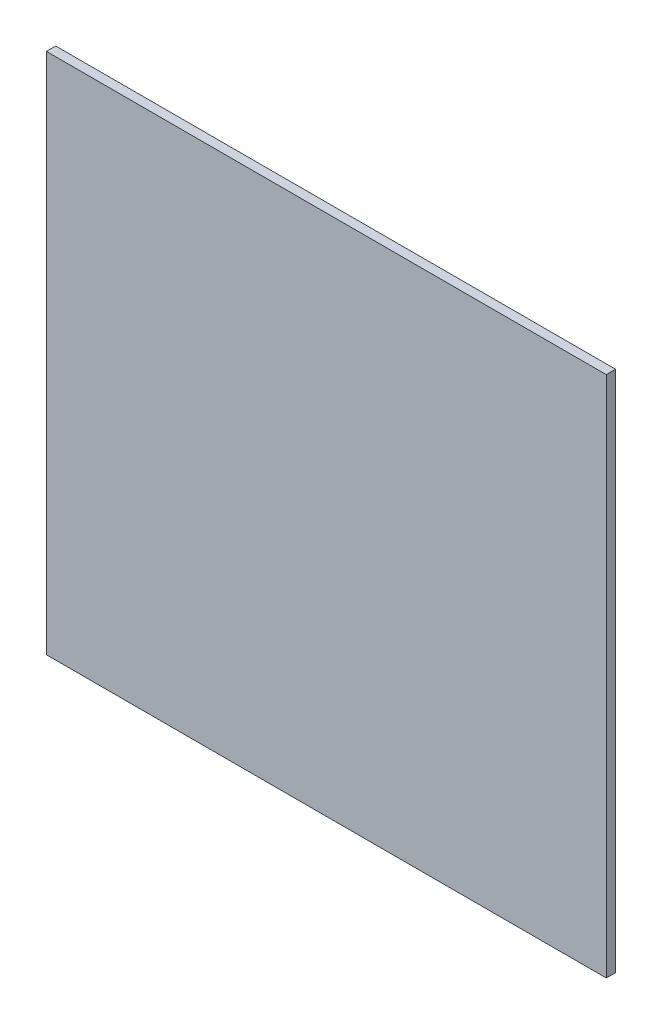
ISO-10303-21;
HEADER;
FILE_DESCRIPTION(('STEP AP214'),'2;1');
FILE_NAME('part.step','',(''),(''),'','','');
FILE_SCHEMA(('AUTOMOTIVE_DESIGN { 1 0 10303 214 1 1 1 1 }'));
ENDSEC;
DATA;
#1=APPLICATION_CONTEXT('core data for automotive mechanical design processes');
#2=APPLICATION_PROTOCOL_DEFINITION('international standard','automotive_design',2000,#1);
#3=PRODUCT_CONTEXT('',#1,'mechanical');
#4=PRODUCT('Part','Part','',(#3));
#5=PRODUCT_RELATED_PRODUCT_CATEGORY('part','',(#4));
#6=PRODUCT_DEFINITION_FORMATION('','',#4);
#7=PRODUCT_DEFINITION_CONTEXT('part definition',#1,'design');
#8=PRODUCT_DEFINITION('design','',#6,#7);
#9=PRODUCT_DEFINITION_SHAPE('','',#8);
#10=(LENGTH_UNIT() NAMED_UNIT(*) SI_UNIT(.MILLI.,.METRE.));
#11=(NAMED_UNIT(*) PLANE_ANGLE_UNIT() SI_UNIT($,.RADIAN.));
#12=(NAMED_UNIT(*) SI_UNIT($,.STERADIAN.) SOLID_ANGLE_UNIT());
#13=UNCERTAINTY_MEASURE_WITH_UNIT(LENGTH_MEASURE(1.E-05),#10,'distance_accuracy_value','');
#14=(GEOMETRIC_REPRESENTATION_CONTEXT(3) GLOBAL_UNCERTAINTY_ASSIGNED_CONTEXT((#13)) GLOBAL_UNIT_ASSIGNED_CONTEXT((#10,
#11,#12)) REPRESENTATION_CONTEXT('',''));
#15=CARTESIAN_POINT('',(0.,0.,0.));
#16=DIRECTION('',(0.,0.,1.));
#17=DIRECTION('',(1.,0.,0.));
#18=AXIS2_PLACEMENT_3D('',#15,#16,#17);
#19=CARTESIAN_POINT('',(150.,140.,5.));
#20=DIRECTION('',(-1.,0.,0.));
#21=DIRECTION('',(0.,-1.,0.));
#22=AXIS2_PLACEMENT_3D('',#19,#20,#21);
#23=PLANE('',#22);
#24=DIRECTION('',(0.,1.,0.));
#25=VECTOR('',#24,1.);
#26=CARTESIAN_POINT('',(150.,140.,0.));
#27=LINE('',#26,#25);
#28=CARTESIAN_POINT('',(150.,-140.,0.));
#29=VERTEX_POINT('',#28);
#30=CARTESIAN_POINT('',(150.,140.,0.));
#31=VERTEX_POINT('',#30);
#32=EDGE_CURVE('E95',#29,#31,#27,.T.);
#33=ORIENTED_EDGE('',*,*,#32,.T.);
#34=DIRECTION('',(0.,0.,-1.));
#35=VECTOR('',#34,1.);
#36=CARTESIAN_POINT('',(150.,140.,5.));
#37=LINE('',#36,#35);
#38=CARTESIAN_POINT('',(150.,140.,5.));
#39=VERTEX_POINT('',#38);
#40=EDGE_CURVE('E11',#39,#31,#37,.T.);
#41=ORIENTED_EDGE('',*,*,#40,.F.);
#42=DIRECTION('',(0.,1.,0.));
#43=VECTOR('',#42,1.);
#44=CARTESIAN_POINT('',(150.,140.,5.));
#45=LINE('',#44,#43);
#46=CARTESIAN_POINT('',(150.,-140.,5.));
#47=VERTEX_POINT('',#46);
#48=EDGE_CURVE('E83',#47,#39,#45,.T.);
#49=ORIENTED_EDGE('',*,*,#48,.F.);
#50=DIRECTION('',(0.,0.,-1.));
#51=VECTOR('',#50,1.);
#52=CARTESIAN_POINT('',(150.,-140.,5.));
#53=LINE('',#52,#51);
#54=EDGE_CURVE('E91',#47,#29,#53,.T.);
#55=ORIENTED_EDGE('',*,*,#54,.T.);
#56=EDGE_LOOP('',(#33,#41,#49,#55));
#57=FACE_BOUND('',#56,.T.);
#58=ADVANCED_FACE('F32',(#57),#23,.F.);
#59=CARTESIAN_POINT('',(-150.,140.,5.));
#60=DIRECTION('',(0.,-1.,0.));
#61=DIRECTION('',(0.,0.,-1.));
#62=AXIS2_PLACEMENT_3D('',#59,#60,#61);
#63=PLANE('',#62);
#64=DIRECTION('',(-1.,0.,0.));
#65=VECTOR('',#64,1.);
#66=CARTESIAN_POINT('',(-150.,140.,0.));
#67=LINE('',#66,#65);
#68=CARTESIAN_POINT('',(-150.,140.,0.));
#69=VERTEX_POINT('',#68);
#70=EDGE_CURVE('E87',#31,#69,#67,.T.);
#71=ORIENTED_EDGE('',*,*,#70,.T.);
#72=DIRECTION('',(0.,0.,-1.));
#73=VECTOR('',#72,1.);
#74=CARTESIAN_POINT('',(-150.,140.,5.));
#75=LINE('',#74,#73);
#76=CARTESIAN_POINT('',(-150.,140.,5.));
#77=VERTEX_POINT('',#76);
#78=EDGE_CURVE('E40',#77,#69,#75,.T.);
#79=ORIENTED_EDGE('',*,*,#78,.F.);
#80=DIRECTION('',(-1.,0.,0.));
#81=VECTOR('',#80,1.);
#82=CARTESIAN_POINT('',(-150.,140.,5.));
#83=LINE('',#82,#81);
#84=EDGE_CURVE('E78',#39,#77,#83,.T.);
#85=ORIENTED_EDGE('',*,*,#84,.F.);
#86=ORIENTED_EDGE('',*,*,#40,.T.);
#87=EDGE_LOOP('',(#71,#79,#85,#86));
#88=FACE_BOUND('',#87,.T.);
#89=ADVANCED_FACE('F86',(#88),#63,.F.);
#90=CARTESIAN_POINT('',(-150.,140.,5.));
#91=DIRECTION('',(1.,0.,0.));
#92=DIRECTION('',(0.,1.,0.));
#93=AXIS2_PLACEMENT_3D('',#90,#91,#92);
#94=PLANE('',#93);
#95=DIRECTION('',(0.,-1.,0.));
#96=VECTOR('',#95,1.);
#97=CARTESIAN_POINT('',(-150.,140.,0.));
#98=LINE('',#97,#96);
#99=CARTESIAN_POINT('',(-150.,-140.,0.));
#100=VERTEX_POINT('',#99);
#101=EDGE_CURVE('E65',#69,#100,#98,.T.);
#102=ORIENTED_EDGE('',*,*,#101,.T.);
#103=DIRECTION('',(0.,0.,-1.));
#104=VECTOR('',#103,1.);
#105=CARTESIAN_POINT('',(-150.,-140.,5.));
#106=LINE('',#105,#104);
#107=CARTESIAN_POINT('',(-150.,-140.,5.));
#108=VERTEX_POINT('',#107);
#109=EDGE_CURVE('E88',#108,#100,#106,.T.);
#110=ORIENTED_EDGE('',*,*,#109,.F.);
#111=DIRECTION('',(0.,-1.,0.));
#112=VECTOR('',#111,1.);
#113=CARTESIAN_POINT('',(-150.,140.,5.));
#114=LINE('',#113,#112);
#115=EDGE_CURVE('E81',#77,#108,#114,.T.);
#116=ORIENTED_EDGE('',*,*,#115,.F.);
#117=ORIENTED_EDGE('',*,*,#78,.T.);
#118=EDGE_LOOP('',(#102,#110,#116,#117));
#119=FACE_BOUND('',#118,.T.);
#120=ADVANCED_FACE('F89',(#119),#94,.F.);
#121=CARTESIAN_POINT('',(-150.,-140.,5.));
#122=DIRECTION('',(0.,1.,0.));
#123=DIRECTION('',(0.,0.,1.));
#124=AXIS2_PLACEMENT_3D('',#121,#122,#123);
#125=PLANE('',#124);
#126=DIRECTION('',(1.,0.,0.));
#127=VECTOR('',#126,1.);
#128=CARTESIAN_POINT('',(-150.,-140.,0.));
#129=LINE('',#128,#127);
#130=EDGE_CURVE('E71',#100,#29,#129,.T.);
#131=ORIENTED_EDGE('',*,*,#130,.T.);
#132=ORIENTED_EDGE('',*,*,#54,.F.);
#133=DIRECTION('',(1.,0.,0.));
#134=VECTOR('',#133,1.);
#135=CARTESIAN_POINT('',(-150.,-140.,5.));
#136=LINE('',#135,#134);
#137=EDGE_CURVE('E48',#108,#47,#136,.T.);
#138=ORIENTED_EDGE('',*,*,#137,.F.);
#139=ORIENTED_EDGE('',*,*,#109,.T.);
#140=EDGE_LOOP('',(#131,#132,#138,#139));
#141=FACE_BOUND('',#140,.T.);
#142=ADVANCED_FACE('F102',(#141),#125,.F.);
#143=CARTESIAN_POINT('',(0.,0.,5.));
#144=DIRECTION('',(0.,0.,1.));
#145=DIRECTION('',(1.,0.,0.));
#146=AXIS2_PLACEMENT_3D('',#143,#144,#145);
#147=PLANE('',#146);
#148=ORIENTED_EDGE('',*,*,#48,.T.);
#149=ORIENTED_EDGE('',*,*,#84,.T.);
#150=ORIENTED_EDGE('',*,*,#115,.T.);
#151=ORIENTED_EDGE('',*,*,#137,.T.);
#152=EDGE_LOOP('',(#148,#149,#150,#151));
#153=FACE_BOUND('',#152,.T.);
#154=ADVANCED_FACE('F79',(#153),#147,.T.);
#155=CARTESIAN_POINT('',(0.,0.,0.));
#156=DIRECTION('',(0.,0.,1.));
#157=DIRECTION('',(1.,0.,0.));
#158=AXIS2_PLACEMENT_3D('',#155,#156,#157);
#159=PLANE('',#158);
#160=ORIENTED_EDGE('',*,*,#32,.F.);
#161=ORIENTED_EDGE('',*,*,#130,.F.);
#162=ORIENTED_EDGE('',*,*,#101,.F.);
#163=ORIENTED_EDGE('',*,*,#70,.F.);
#164=EDGE_LOOP('',(#160,#161,#162,#163));
#165=FACE_BOUND('',#164,.T.);
#166=ADVANCED_FACE('F105',(#165),#159,.F.);
#167=CLOSED_SHELL('',(#58,#89,#120,#142,#154,#166));
#168=MANIFOLD_SOLID_BREP('B2',#167);
#169=ADVANCED_BREP_SHAPE_REPRESENTATION('',(#18,#168),#14);
#170=SHAPE_DEFINITION_REPRESENTATION(#9,#169);
ENDSEC;
END-ISO-10303-21;
